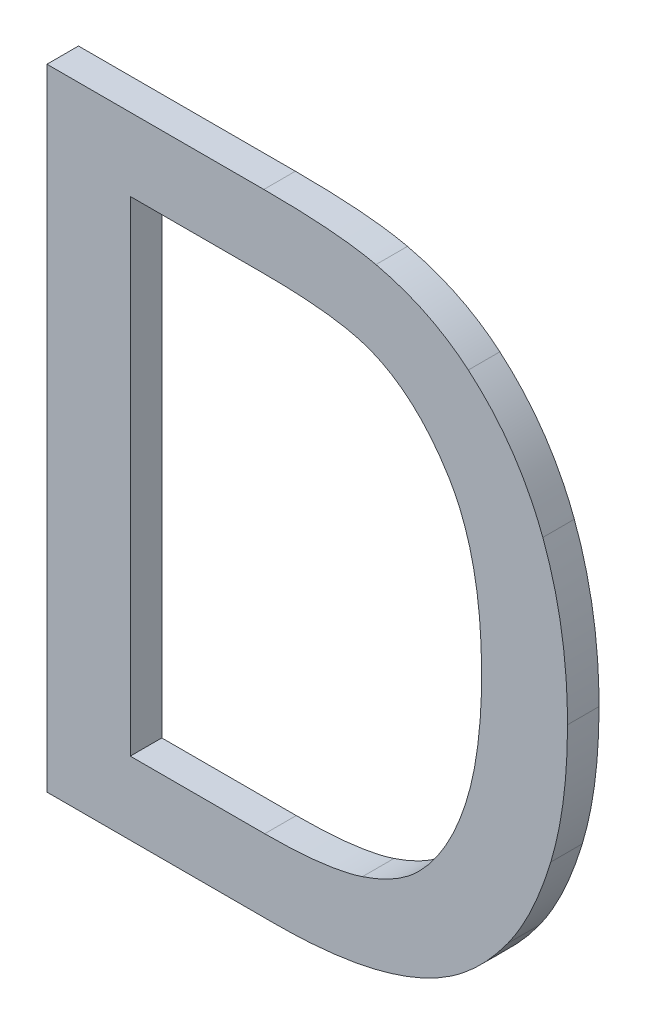
ISO-10303-21;
HEADER;
FILE_DESCRIPTION(('STEP AP214'),'2;1');
FILE_NAME('part.step','',(''),(''),'','','');
FILE_SCHEMA(('AUTOMOTIVE_DESIGN { 1 0 10303 214 1 1 1 1 }'));
ENDSEC;
DATA;
#1=APPLICATION_CONTEXT('core data for automotive mechanical design processes');
#2=APPLICATION_PROTOCOL_DEFINITION('international standard','automotive_design',2000,#1);
#3=PRODUCT_CONTEXT('',#1,'mechanical');
#4=PRODUCT('Part','Part','',(#3));
#5=PRODUCT_RELATED_PRODUCT_CATEGORY('part','',(#4));
#6=PRODUCT_DEFINITION_FORMATION('','',#4);
#7=PRODUCT_DEFINITION_CONTEXT('part definition',#1,'design');
#8=PRODUCT_DEFINITION('design','',#6,#7);
#9=PRODUCT_DEFINITION_SHAPE('','',#8);
#10=(LENGTH_UNIT() NAMED_UNIT(*) SI_UNIT(.MILLI.,.METRE.));
#11=(NAMED_UNIT(*) PLANE_ANGLE_UNIT() SI_UNIT($,.RADIAN.));
#12=(NAMED_UNIT(*) SI_UNIT($,.STERADIAN.) SOLID_ANGLE_UNIT());
#13=UNCERTAINTY_MEASURE_WITH_UNIT(LENGTH_MEASURE(1.E-05),#10,'distance_accuracy_value','');
#14=(GEOMETRIC_REPRESENTATION_CONTEXT(3) GLOBAL_UNCERTAINTY_ASSIGNED_CONTEXT((#13)) GLOBAL_UNIT_ASSIGNED_CONTEXT((#10,
#11,#12)) REPRESENTATION_CONTEXT('',''));
#15=CARTESIAN_POINT('',(0.,0.,0.));
#16=DIRECTION('',(0.,0.,1.));
#17=DIRECTION('',(1.,0.,0.));
#18=AXIS2_PLACEMENT_3D('',#15,#16,#17);
#19=CARTESIAN_POINT('',(11.292084779264,0.500354481602,0.05));
#20=DIRECTION('',(0.,0.,1.));
#21=DIRECTION('',(1.,0.,0.));
#22=AXIS2_PLACEMENT_3D('',#19,#20,#21);
#23=PLANE('',#22);
#24=DIRECTION('',(1.,0.,0.));
#25=VECTOR('',#24,1.);
#26=CARTESIAN_POINT('',(11.059683866279,0.115552325581,0.05));
#27=LINE('',#26,#25);
#28=CARTESIAN_POINT('',(11.059683866279,0.115552325581,0.05));
#29=VERTEX_POINT('',#28);
#30=CARTESIAN_POINT('',(11.272937863372,0.115552325581,0.05));
#31=VERTEX_POINT('',#30);
#32=EDGE_CURVE('E249',#29,#31,#27,.T.);
#33=ORIENTED_EDGE('',*,*,#32,.F.);
#34=DIRECTION('',(0.,-1.,0.));
#35=VECTOR('',#34,1.);
#36=CARTESIAN_POINT('',(11.059683866279,0.884447674419,0.05));
#37=LINE('',#36,#35);
#38=CARTESIAN_POINT('',(11.059683866279,0.884447674419,0.05));
#39=VERTEX_POINT('',#38);
#40=EDGE_CURVE('E91',#39,#29,#37,.T.);
#41=ORIENTED_EDGE('',*,*,#40,.F.);
#42=DIRECTION('',(-1.,0.,0.));
#43=VECTOR('',#42,1.);
#44=CARTESIAN_POINT('',(11.26953125,0.884447674419,0.05));
#45=LINE('',#44,#43);
#46=CARTESIAN_POINT('',(11.26953125,0.884447674419,0.05));
#47=VERTEX_POINT('',#46);
#48=EDGE_CURVE('E238',#47,#39,#45,.T.);
#49=ORIENTED_EDGE('',*,*,#48,.F.);
#50=CARTESIAN_POINT('',(11.440543241279,0.863871729651,0.05));
#51=CARTESIAN_POINT('',(11.387400072674,0.884447674419,0.05));
#52=CARTESIAN_POINT('',(11.26953125,0.884447674419,0.05));
#53=(BOUNDED_CURVE() B_SPLINE_CURVE(2,(#50,#51,#52),.UNSPECIFIED.,.F.,
.F.) B_SPLINE_CURVE_WITH_KNOTS((3,3),(0.,1.),
.UNSPECIFIED.) CURVE() GEOMETRIC_REPRESENTATION_ITEM() RATIONAL_B_SPLINE_CURVE((1.,1.,1.)) REPRESENTATION_ITEM(''));
#54=CARTESIAN_POINT('',(11.440543241279,0.863871729651,0.05));
#55=VERTEX_POINT('',#54);
#56=EDGE_CURVE('E248',#55,#47,#53,.T.);
#57=ORIENTED_EDGE('',*,*,#56,.F.);
#58=CARTESIAN_POINT('',(11.565543241279,0.750227107558,0.05));
#59=CARTESIAN_POINT('',(11.514126090116,0.835029069767,0.05));
#60=CARTESIAN_POINT('',(11.440543241279,0.863871729651,0.05));
#61=(BOUNDED_CURVE() B_SPLINE_CURVE(2,(#58,#59,#60),.UNSPECIFIED.,.F.,
.F.) B_SPLINE_CURVE_WITH_KNOTS((3,3),(0.,1.),
.UNSPECIFIED.) CURVE() GEOMETRIC_REPRESENTATION_ITEM() RATIONAL_B_SPLINE_CURVE((1.,1.,1.)) REPRESENTATION_ITEM(''));
#62=CARTESIAN_POINT('',(11.565543241279,0.750227107558,0.05));
#63=VERTEX_POINT('',#62);
#64=EDGE_CURVE('E373',#63,#55,#61,.T.);
#65=ORIENTED_EDGE('',*,*,#64,.F.);
#66=CARTESIAN_POINT('',(11.617005813953,0.50753997093,0.05));
#67=CARTESIAN_POINT('',(11.617005813953,0.66547056686,0.05));
#68=CARTESIAN_POINT('',(11.565543241279,0.750227107558,0.05));
#69=(BOUNDED_CURVE() B_SPLINE_CURVE(2,(#66,#67,#68),.UNSPECIFIED.,.F.,
.F.) B_SPLINE_CURVE_WITH_KNOTS((3,3),(0.,1.),
.UNSPECIFIED.) CURVE() GEOMETRIC_REPRESENTATION_ITEM() RATIONAL_B_SPLINE_CURVE((1.,1.,1.)) REPRESENTATION_ITEM(''));
#70=CARTESIAN_POINT('',(11.617005813953,0.50753997093,0.05));
#71=VERTEX_POINT('',#70);
#72=EDGE_CURVE('E322',#71,#63,#69,.T.);
#73=ORIENTED_EDGE('',*,*,#72,.F.);
#74=CARTESIAN_POINT('',(11.590752180233,0.313590116279,0.05));
#75=CARTESIAN_POINT('',(11.617005813953,0.393577398256,0.05));
#76=CARTESIAN_POINT('',(11.617005813953,0.50753997093,0.05));
#77=(BOUNDED_CURVE() B_SPLINE_CURVE(2,(#74,#75,#76),.UNSPECIFIED.,.F.,
.F.) B_SPLINE_CURVE_WITH_KNOTS((3,3),(0.,1.),
.UNSPECIFIED.) CURVE() GEOMETRIC_REPRESENTATION_ITEM() RATIONAL_B_SPLINE_CURVE((1.,1.,1.)) REPRESENTATION_ITEM(''));
#78=CARTESIAN_POINT('',(11.590752180233,0.313590116279,0.05));
#79=VERTEX_POINT('',#78);
#80=EDGE_CURVE('E580',#79,#71,#77,.T.);
#81=ORIENTED_EDGE('',*,*,#80,.F.);
#82=CARTESIAN_POINT('',(11.517532703488,0.186273619186,0.05));
#83=CARTESIAN_POINT('',(11.564543968023,0.233648255814,0.05));
#84=CARTESIAN_POINT('',(11.590752180233,0.313590116279,0.05));
#85=(BOUNDED_CURVE() B_SPLINE_CURVE(2,(#82,#83,#84),.UNSPECIFIED.,.F.,
.F.) B_SPLINE_CURVE_WITH_KNOTS((3,3),(0.,1.),
.UNSPECIFIED.) CURVE() GEOMETRIC_REPRESENTATION_ITEM() RATIONAL_B_SPLINE_CURVE((1.,1.,1.)) REPRESENTATION_ITEM(''));
#86=CARTESIAN_POINT('',(11.517532703488,0.186273619186,0.05));
#87=VERTEX_POINT('',#86);
#88=EDGE_CURVE('E332',#87,#79,#85,.T.);
#89=ORIENTED_EDGE('',*,*,#88,.F.);
#90=CARTESIAN_POINT('',(11.427916061047,0.134084302326,0.05));
#91=CARTESIAN_POINT('',(11.484147892442,0.15261627907,0.05));
#92=CARTESIAN_POINT('',(11.517532703488,0.186273619186,0.05));
#93=(BOUNDED_CURVE() B_SPLINE_CURVE(2,(#90,#91,#92),.UNSPECIFIED.,.F.,
.F.) B_SPLINE_CURVE_WITH_KNOTS((3,3),(0.,1.),
.UNSPECIFIED.) CURVE() GEOMETRIC_REPRESENTATION_ITEM() RATIONAL_B_SPLINE_CURVE((1.,1.,1.)) REPRESENTATION_ITEM(''));
#94=CARTESIAN_POINT('',(11.427916061047,0.134084302326,0.05));
#95=VERTEX_POINT('',#94);
#96=EDGE_CURVE('E303',#95,#87,#93,.T.);
#97=ORIENTED_EDGE('',*,*,#96,.F.);
#98=CARTESIAN_POINT('',(11.272937863372,0.115552325581,0.05));
#99=CARTESIAN_POINT('',(11.371729651163,0.115552325581,0.05));
#100=CARTESIAN_POINT('',(11.427916061047,0.134084302326,0.05));
#101=(BOUNDED_CURVE() B_SPLINE_CURVE(2,(#98,#99,#100),.UNSPECIFIED.,.F.,
.F.) B_SPLINE_CURVE_WITH_KNOTS((3,3),(0.,1.),
.UNSPECIFIED.) CURVE() GEOMETRIC_REPRESENTATION_ITEM() RATIONAL_B_SPLINE_CURVE((1.,1.,1.)) REPRESENTATION_ITEM(''));
#102=EDGE_CURVE('E29',#31,#95,#101,.T.);
#103=ORIENTED_EDGE('',*,*,#102,.F.);
#104=EDGE_LOOP('',(#33,#41,#49,#57,#65,#73,#81,#89,#97,#103));
#105=FACE_BOUND('',#104,.T.);
#106=DIRECTION('',(0.,1.,0.));
#107=VECTOR('',#106,1.);
#108=CARTESIAN_POINT('',(10.927507267442,0.,0.05));
#109=LINE('',#108,#107);
#110=CARTESIAN_POINT('',(10.927507267442,0.,0.05));
#111=VERTEX_POINT('',#110);
#112=CARTESIAN_POINT('',(10.927507267442,1.,0.05));
#113=VERTEX_POINT('',#112);
#114=EDGE_CURVE('E239',#111,#113,#109,.T.);
#115=ORIENTED_EDGE('',*,*,#114,.F.);
#116=DIRECTION('',(-1.,0.,0.));
#117=VECTOR('',#116,1.);
#118=CARTESIAN_POINT('',(11.287926962209,0.,0.05));
#119=LINE('',#118,#117);
#120=CARTESIAN_POINT('',(11.287926962209,0.,0.05));
#121=VERTEX_POINT('',#120);
#122=EDGE_CURVE('E268',#121,#111,#119,.T.);
#123=ORIENTED_EDGE('',*,*,#122,.F.);
#124=CARTESIAN_POINT('',(11.448355741279,0.01703306686047,0.05));
#125=CARTESIAN_POINT('',(11.378542877907,0.,0.05));
#126=CARTESIAN_POINT('',(11.287926962209,0.,0.05));
#127=(BOUNDED_CURVE() B_SPLINE_CURVE(2,(#124,#125,#126),.UNSPECIFIED.,.F.,
.F.) B_SPLINE_CURVE_WITH_KNOTS((3,3),(0.,1.),
.UNSPECIFIED.) CURVE() GEOMETRIC_REPRESENTATION_ITEM() RATIONAL_B_SPLINE_CURVE((1.,1.,1.)) REPRESENTATION_ITEM(''));
#128=CARTESIAN_POINT('',(11.448355741279,0.01703306686047,0.05));
#129=VERTEX_POINT('',#128);
#130=EDGE_CURVE('E396',#129,#121,#127,.T.);
#131=ORIENTED_EDGE('',*,*,#130,.F.);
#132=CARTESIAN_POINT('',(11.567587209302,0.06717841569767,0.05));
#133=CARTESIAN_POINT('',(11.518214026163,0.03411155523256,0.05));
#134=CARTESIAN_POINT('',(11.448355741279,0.01703306686047,0.05));
#135=(BOUNDED_CURVE() B_SPLINE_CURVE(2,(#132,#133,#134),.UNSPECIFIED.,.F.,
.F.) B_SPLINE_CURVE_WITH_KNOTS((3,3),(0.,1.),
.UNSPECIFIED.) CURVE() GEOMETRIC_REPRESENTATION_ITEM() RATIONAL_B_SPLINE_CURVE((1.,1.,1.)) REPRESENTATION_ITEM(''));
#136=CARTESIAN_POINT('',(11.567587209302,0.06717841569767,0.05));
#137=VERTEX_POINT('',#136);
#138=EDGE_CURVE('E281',#137,#129,#135,.T.);
#139=ORIENTED_EDGE('',*,*,#138,.F.);
#140=CARTESIAN_POINT('',(11.658566497093,0.15793059593,0.05));
#141=CARTESIAN_POINT('',(11.617005813953,0.100290697674,0.05));
#142=CARTESIAN_POINT('',(11.567587209302,0.06717841569767,0.05));
#143=(BOUNDED_CURVE() B_SPLINE_CURVE(2,(#140,#141,#142),.UNSPECIFIED.,.F.,
.F.) B_SPLINE_CURVE_WITH_KNOTS((3,3),(0.,1.),
.UNSPECIFIED.) CURVE() GEOMETRIC_REPRESENTATION_ITEM() RATIONAL_B_SPLINE_CURVE((1.,1.,1.)) REPRESENTATION_ITEM(''));
#144=CARTESIAN_POINT('',(11.658566497093,0.15793059593,0.05));
#145=VERTEX_POINT('',#144);
#146=EDGE_CURVE('E155',#145,#137,#143,.T.);
#147=ORIENTED_EDGE('',*,*,#146,.F.);
#148=CARTESIAN_POINT('',(11.726698764535,0.303551962209,0.05));
#149=CARTESIAN_POINT('',(11.700127180233,0.215570494186,0.05));
#150=CARTESIAN_POINT('',(11.658566497093,0.15793059593,0.05));
#151=(BOUNDED_CURVE() B_SPLINE_CURVE(2,(#148,#149,#150),.UNSPECIFIED.,.F.,
.F.) B_SPLINE_CURVE_WITH_KNOTS((3,3),(0.,1.),
.UNSPECIFIED.) CURVE() GEOMETRIC_REPRESENTATION_ITEM() RATIONAL_B_SPLINE_CURVE((1.,1.,1.)) REPRESENTATION_ITEM(''));
#152=CARTESIAN_POINT('',(11.726698764535,0.303551962209,0.05));
#153=VERTEX_POINT('',#152);
#154=EDGE_CURVE('E214',#153,#145,#151,.T.);
#155=ORIENTED_EDGE('',*,*,#154,.F.);
#156=CARTESIAN_POINT('',(11.753270348837,0.505450581395,0.05));
#157=CARTESIAN_POINT('',(11.753270348837,0.391533430233,0.05));
#158=CARTESIAN_POINT('',(11.726698764535,0.303551962209,0.05));
#159=(BOUNDED_CURVE() B_SPLINE_CURVE(2,(#156,#157,#158),.UNSPECIFIED.,.F.,
.F.) B_SPLINE_CURVE_WITH_KNOTS((3,3),(0.,1.),
.UNSPECIFIED.) CURVE() GEOMETRIC_REPRESENTATION_ITEM() RATIONAL_B_SPLINE_CURVE((1.,1.,1.)) REPRESENTATION_ITEM(''));
#160=CARTESIAN_POINT('',(11.753270348837,0.505450581395,0.05));
#161=VERTEX_POINT('',#160);
#162=EDGE_CURVE('E20',#161,#153,#159,.T.);
#163=ORIENTED_EDGE('',*,*,#162,.F.);
#164=CARTESIAN_POINT('',(11.714071584302,0.743186773256,0.05));
#165=CARTESIAN_POINT('',(11.753270348837,0.639171511628,0.05));
#166=CARTESIAN_POINT('',(11.753270348837,0.505450581395,0.05));
#167=(BOUNDED_CURVE() B_SPLINE_CURVE(2,(#164,#165,#166),.UNSPECIFIED.,.F.,
.F.) B_SPLINE_CURVE_WITH_KNOTS((3,3),(0.,1.),
.UNSPECIFIED.) CURVE() GEOMETRIC_REPRESENTATION_ITEM() RATIONAL_B_SPLINE_CURVE((1.,1.,1.)) REPRESENTATION_ITEM(''));
#168=CARTESIAN_POINT('',(11.714071584302,0.743186773256,0.05));
#169=VERTEX_POINT('',#168);
#170=EDGE_CURVE('E199',#169,#161,#167,.T.);
#171=ORIENTED_EDGE('',*,*,#170,.F.);
#172=CARTESIAN_POINT('',(11.595884811047,0.9140625,0.05));
#173=CARTESIAN_POINT('',(11.674918241279,0.847202034884,0.05));
#174=CARTESIAN_POINT('',(11.714071584302,0.743186773256,0.05));
#175=(BOUNDED_CURVE() B_SPLINE_CURVE(2,(#172,#173,#174),.UNSPECIFIED.,.F.,
.F.) B_SPLINE_CURVE_WITH_KNOTS((3,3),(0.,1.),
.UNSPECIFIED.) CURVE() GEOMETRIC_REPRESENTATION_ITEM() RATIONAL_B_SPLINE_CURVE((1.,1.,1.)) REPRESENTATION_ITEM(''));
#176=CARTESIAN_POINT('',(11.595884811047,0.9140625,0.05));
#177=VERTEX_POINT('',#176);
#178=EDGE_CURVE('E380',#177,#169,#175,.T.);
#179=ORIENTED_EDGE('',*,*,#178,.F.);
#180=CARTESIAN_POINT('',(11.449400436047,0.985692223837,0.05));
#181=CARTESIAN_POINT('',(11.535247093023,0.965888444767,0.05));
#182=CARTESIAN_POINT('',(11.595884811047,0.9140625,0.05));
#183=(BOUNDED_CURVE() B_SPLINE_CURVE(2,(#180,#181,#182),.UNSPECIFIED.,.F.,
.F.) B_SPLINE_CURVE_WITH_KNOTS((3,3),(0.,1.),
.UNSPECIFIED.) CURVE() GEOMETRIC_REPRESENTATION_ITEM() RATIONAL_B_SPLINE_CURVE((1.,1.,1.)) REPRESENTATION_ITEM(''));
#184=CARTESIAN_POINT('',(11.449400436047,0.985692223837,0.05));
#185=VERTEX_POINT('',#184);
#186=EDGE_CURVE('E426',#185,#177,#183,.T.);
#187=ORIENTED_EDGE('',*,*,#186,.F.);
#188=CARTESIAN_POINT('',(11.271575218023,1.,0.05));
#189=CARTESIAN_POINT('',(11.388081395349,1.,0.05));
#190=CARTESIAN_POINT('',(11.449400436047,0.985692223837,0.05));
#191=(BOUNDED_CURVE() B_SPLINE_CURVE(2,(#188,#189,#190),.UNSPECIFIED.,.F.,
.F.) B_SPLINE_CURVE_WITH_KNOTS((3,3),(0.,1.),
.UNSPECIFIED.) CURVE() GEOMETRIC_REPRESENTATION_ITEM() RATIONAL_B_SPLINE_CURVE((1.,1.,1.)) REPRESENTATION_ITEM(''));
#192=CARTESIAN_POINT('',(11.271575218023,1.,0.05));
#193=VERTEX_POINT('',#192);
#194=EDGE_CURVE('E231',#193,#185,#191,.T.);
#195=ORIENTED_EDGE('',*,*,#194,.F.);
#196=DIRECTION('',(1.,0.,0.));
#197=VECTOR('',#196,1.);
#198=CARTESIAN_POINT('',(10.927507267442,1.,0.05));
#199=LINE('',#198,#197);
#200=EDGE_CURVE('E260',#113,#193,#199,.T.);
#201=ORIENTED_EDGE('',*,*,#200,.F.);
#202=EDGE_LOOP('',(#115,#123,#131,#139,#147,#155,#163,#171,#179,#187,#195,#201));
#203=FACE_BOUND('',#202,.T.);
#204=ADVANCED_FACE('F17',(#105,#203),#23,.T.);
#205=CARTESIAN_POINT('',(11.292084779264,0.500354481602,0.));
#206=DIRECTION('',(0.,0.,1.));
#207=DIRECTION('',(1.,0.,0.));
#208=AXIS2_PLACEMENT_3D('',#205,#206,#207);
#209=PLANE('',#208);
#210=CARTESIAN_POINT('',(11.272937863372,0.115552325581,0.));
#211=CARTESIAN_POINT('',(11.371729651163,0.115552325581,0.));
#212=CARTESIAN_POINT('',(11.427916061047,0.134084302326,0.));
#213=(BOUNDED_CURVE() B_SPLINE_CURVE(2,(#210,#211,#212),.UNSPECIFIED.,.F.,
.F.) B_SPLINE_CURVE_WITH_KNOTS((3,3),(0.,1.),
.UNSPECIFIED.) CURVE() GEOMETRIC_REPRESENTATION_ITEM() RATIONAL_B_SPLINE_CURVE((1.,1.,1.)) REPRESENTATION_ITEM(''));
#214=CARTESIAN_POINT('',(11.272937863372,0.115552325581,0.));
#215=VERTEX_POINT('',#214);
#216=CARTESIAN_POINT('',(11.427916061047,0.134084302326,0.));
#217=VERTEX_POINT('',#216);
#218=EDGE_CURVE('E11',#215,#217,#213,.T.);
#219=ORIENTED_EDGE('',*,*,#218,.T.);
#220=CARTESIAN_POINT('',(11.427916061047,0.134084302326,0.));
#221=CARTESIAN_POINT('',(11.484147892442,0.15261627907,0.));
#222=CARTESIAN_POINT('',(11.517532703488,0.186273619186,0.));
#223=(BOUNDED_CURVE() B_SPLINE_CURVE(2,(#220,#221,#222),.UNSPECIFIED.,.F.,
.F.) B_SPLINE_CURVE_WITH_KNOTS((3,3),(0.,1.),
.UNSPECIFIED.) CURVE() GEOMETRIC_REPRESENTATION_ITEM() RATIONAL_B_SPLINE_CURVE((1.,1.,1.)) REPRESENTATION_ITEM(''));
#224=CARTESIAN_POINT('',(11.517532703488,0.186273619186,0.));
#225=VERTEX_POINT('',#224);
#226=EDGE_CURVE('E302',#217,#225,#223,.T.);
#227=ORIENTED_EDGE('',*,*,#226,.T.);
#228=CARTESIAN_POINT('',(11.517532703488,0.186273619186,0.));
#229=CARTESIAN_POINT('',(11.564543968023,0.233648255814,0.));
#230=CARTESIAN_POINT('',(11.590752180233,0.313590116279,0.));
#231=(BOUNDED_CURVE() B_SPLINE_CURVE(2,(#228,#229,#230),.UNSPECIFIED.,.F.,
.F.) B_SPLINE_CURVE_WITH_KNOTS((3,3),(0.,1.),
.UNSPECIFIED.) CURVE() GEOMETRIC_REPRESENTATION_ITEM() RATIONAL_B_SPLINE_CURVE((1.,1.,1.)) REPRESENTATION_ITEM(''));
#232=CARTESIAN_POINT('',(11.590752180233,0.313590116279,0.));
#233=VERTEX_POINT('',#232);
#234=EDGE_CURVE('E323',#225,#233,#231,.T.);
#235=ORIENTED_EDGE('',*,*,#234,.T.);
#236=CARTESIAN_POINT('',(11.590752180233,0.313590116279,0.));
#237=CARTESIAN_POINT('',(11.617005813953,0.393577398256,0.));
#238=CARTESIAN_POINT('',(11.617005813953,0.50753997093,0.));
#239=(BOUNDED_CURVE() B_SPLINE_CURVE(2,(#236,#237,#238),.UNSPECIFIED.,.F.,
.F.) B_SPLINE_CURVE_WITH_KNOTS((3,3),(0.,1.),
.UNSPECIFIED.) CURVE() GEOMETRIC_REPRESENTATION_ITEM() RATIONAL_B_SPLINE_CURVE((1.,1.,1.)) REPRESENTATION_ITEM(''));
#240=CARTESIAN_POINT('',(11.617005813953,0.50753997093,0.));
#241=VERTEX_POINT('',#240);
#242=EDGE_CURVE('E506',#233,#241,#239,.T.);
#243=ORIENTED_EDGE('',*,*,#242,.T.);
#244=CARTESIAN_POINT('',(11.617005813953,0.50753997093,0.));
#245=CARTESIAN_POINT('',(11.617005813953,0.66547056686,0.));
#246=CARTESIAN_POINT('',(11.565543241279,0.750227107558,0.));
#247=(BOUNDED_CURVE() B_SPLINE_CURVE(2,(#244,#245,#246),.UNSPECIFIED.,.F.,
.F.) B_SPLINE_CURVE_WITH_KNOTS((3,3),(0.,1.),
.UNSPECIFIED.) CURVE() GEOMETRIC_REPRESENTATION_ITEM() RATIONAL_B_SPLINE_CURVE((1.,1.,1.)) REPRESENTATION_ITEM(''));
#248=CARTESIAN_POINT('',(11.565543241279,0.750227107558,0.));
#249=VERTEX_POINT('',#248);
#250=EDGE_CURVE('E313',#241,#249,#247,.T.);
#251=ORIENTED_EDGE('',*,*,#250,.T.);
#252=CARTESIAN_POINT('',(11.565543241279,0.750227107558,0.));
#253=CARTESIAN_POINT('',(11.514126090116,0.835029069767,0.));
#254=CARTESIAN_POINT('',(11.440543241279,0.863871729651,0.));
#255=(BOUNDED_CURVE() B_SPLINE_CURVE(2,(#252,#253,#254),.UNSPECIFIED.,.F.,
.F.) B_SPLINE_CURVE_WITH_KNOTS((3,3),(0.,1.),
.UNSPECIFIED.) CURVE() GEOMETRIC_REPRESENTATION_ITEM() RATIONAL_B_SPLINE_CURVE((1.,1.,1.)) REPRESENTATION_ITEM(''));
#256=CARTESIAN_POINT('',(11.440543241279,0.863871729651,0.));
#257=VERTEX_POINT('',#256);
#258=EDGE_CURVE('E430',#249,#257,#255,.T.);
#259=ORIENTED_EDGE('',*,*,#258,.T.);
#260=CARTESIAN_POINT('',(11.440543241279,0.863871729651,0.));
#261=CARTESIAN_POINT('',(11.387400072674,0.884447674419,0.));
#262=CARTESIAN_POINT('',(11.26953125,0.884447674419,0.));
#263=(BOUNDED_CURVE() B_SPLINE_CURVE(2,(#260,#261,#262),.UNSPECIFIED.,.F.,
.F.) B_SPLINE_CURVE_WITH_KNOTS((3,3),(0.,1.),
.UNSPECIFIED.) CURVE() GEOMETRIC_REPRESENTATION_ITEM() RATIONAL_B_SPLINE_CURVE((1.,1.,1.)) REPRESENTATION_ITEM(''));
#264=CARTESIAN_POINT('',(11.26953125,0.884447674419,0.));
#265=VERTEX_POINT('',#264);
#266=EDGE_CURVE('E374',#257,#265,#263,.T.);
#267=ORIENTED_EDGE('',*,*,#266,.T.);
#268=DIRECTION('',(-1.,0.,0.));
#269=VECTOR('',#268,1.);
#270=CARTESIAN_POINT('',(11.26953125,0.884447674419,0.));
#271=LINE('',#270,#269);
#272=CARTESIAN_POINT('',(11.059683866279,0.884447674419,0.));
#273=VERTEX_POINT('',#272);
#274=EDGE_CURVE('E235',#265,#273,#271,.T.);
#275=ORIENTED_EDGE('',*,*,#274,.T.);
#276=DIRECTION('',(0.,-1.,0.));
#277=VECTOR('',#276,1.);
#278=CARTESIAN_POINT('',(11.059683866279,0.884447674419,0.));
#279=LINE('',#278,#277);
#280=CARTESIAN_POINT('',(11.059683866279,0.115552325581,0.));
#281=VERTEX_POINT('',#280);
#282=EDGE_CURVE('E104',#273,#281,#279,.T.);
#283=ORIENTED_EDGE('',*,*,#282,.T.);
#284=DIRECTION('',(1.,0.,0.));
#285=VECTOR('',#284,1.);
#286=CARTESIAN_POINT('',(11.059683866279,0.115552325581,0.));
#287=LINE('',#286,#285);
#288=EDGE_CURVE('E436',#281,#215,#287,.T.);
#289=ORIENTED_EDGE('',*,*,#288,.T.);
#290=EDGE_LOOP('',(#219,#227,#235,#243,#251,#259,#267,#275,#283,#289));
#291=FACE_BOUND('',#290,.T.);
#292=DIRECTION('',(1.,0.,0.));
#293=VECTOR('',#292,1.);
#294=CARTESIAN_POINT('',(10.927507267442,1.,0.));
#295=LINE('',#294,#293);
#296=CARTESIAN_POINT('',(10.927507267442,1.,0.));
#297=VERTEX_POINT('',#296);
#298=CARTESIAN_POINT('',(11.271575218023,1.,0.));
#299=VERTEX_POINT('',#298);
#300=EDGE_CURVE('E280',#297,#299,#295,.T.);
#301=ORIENTED_EDGE('',*,*,#300,.T.);
#302=CARTESIAN_POINT('',(11.271575218023,1.,0.));
#303=CARTESIAN_POINT('',(11.388081395349,1.,0.));
#304=CARTESIAN_POINT('',(11.449400436047,0.985692223837,0.));
#305=(BOUNDED_CURVE() B_SPLINE_CURVE(2,(#302,#303,#304),.UNSPECIFIED.,.F.,
.F.) B_SPLINE_CURVE_WITH_KNOTS((3,3),(0.,1.),
.UNSPECIFIED.) CURVE() GEOMETRIC_REPRESENTATION_ITEM() RATIONAL_B_SPLINE_CURVE((1.,1.,1.)) REPRESENTATION_ITEM(''));
#306=CARTESIAN_POINT('',(11.449400436047,0.985692223837,0.));
#307=VERTEX_POINT('',#306);
#308=EDGE_CURVE('E255',#299,#307,#305,.T.);
#309=ORIENTED_EDGE('',*,*,#308,.T.);
#310=CARTESIAN_POINT('',(11.449400436047,0.985692223837,0.));
#311=CARTESIAN_POINT('',(11.535247093023,0.965888444767,0.));
#312=CARTESIAN_POINT('',(11.595884811047,0.9140625,0.));
#313=(BOUNDED_CURVE() B_SPLINE_CURVE(2,(#310,#311,#312),.UNSPECIFIED.,.F.,
.F.) B_SPLINE_CURVE_WITH_KNOTS((3,3),(0.,1.),
.UNSPECIFIED.) CURVE() GEOMETRIC_REPRESENTATION_ITEM() RATIONAL_B_SPLINE_CURVE((1.,1.,1.)) REPRESENTATION_ITEM(''));
#314=CARTESIAN_POINT('',(11.595884811047,0.9140625,0.));
#315=VERTEX_POINT('',#314);
#316=EDGE_CURVE('E495',#307,#315,#313,.T.);
#317=ORIENTED_EDGE('',*,*,#316,.T.);
#318=CARTESIAN_POINT('',(11.595884811047,0.9140625,0.));
#319=CARTESIAN_POINT('',(11.674918241279,0.847202034884,0.));
#320=CARTESIAN_POINT('',(11.714071584302,0.743186773256,0.));
#321=(BOUNDED_CURVE() B_SPLINE_CURVE(2,(#318,#319,#320),.UNSPECIFIED.,.F.,
.F.) B_SPLINE_CURVE_WITH_KNOTS((3,3),(0.,1.),
.UNSPECIFIED.) CURVE() GEOMETRIC_REPRESENTATION_ITEM() RATIONAL_B_SPLINE_CURVE((1.,1.,1.)) REPRESENTATION_ITEM(''));
#322=CARTESIAN_POINT('',(11.714071584302,0.743186773256,0.));
#323=VERTEX_POINT('',#322);
#324=EDGE_CURVE('E190',#315,#323,#321,.T.);
#325=ORIENTED_EDGE('',*,*,#324,.T.);
#326=CARTESIAN_POINT('',(11.714071584302,0.743186773256,0.));
#327=CARTESIAN_POINT('',(11.753270348837,0.639171511628,0.));
#328=CARTESIAN_POINT('',(11.753270348837,0.505450581395,0.));
#329=(BOUNDED_CURVE() B_SPLINE_CURVE(2,(#326,#327,#328),.UNSPECIFIED.,.F.,
.F.) B_SPLINE_CURVE_WITH_KNOTS((3,3),(0.,1.),
.UNSPECIFIED.) CURVE() GEOMETRIC_REPRESENTATION_ITEM() RATIONAL_B_SPLINE_CURVE((1.,1.,1.)) REPRESENTATION_ITEM(''));
#330=CARTESIAN_POINT('',(11.753270348837,0.505450581395,0.));
#331=VERTEX_POINT('',#330);
#332=EDGE_CURVE('E209',#323,#331,#329,.T.);
#333=ORIENTED_EDGE('',*,*,#332,.T.);
#334=CARTESIAN_POINT('',(11.753270348837,0.505450581395,0.));
#335=CARTESIAN_POINT('',(11.753270348837,0.391533430233,0.));
#336=CARTESIAN_POINT('',(11.726698764535,0.303551962209,0.));
#337=(BOUNDED_CURVE() B_SPLINE_CURVE(2,(#334,#335,#336),.UNSPECIFIED.,.F.,
.F.) B_SPLINE_CURVE_WITH_KNOTS((3,3),(0.,1.),
.UNSPECIFIED.) CURVE() GEOMETRIC_REPRESENTATION_ITEM() RATIONAL_B_SPLINE_CURVE((1.,1.,1.)) REPRESENTATION_ITEM(''));
#338=CARTESIAN_POINT('',(11.726698764535,0.303551962209,0.));
#339=VERTEX_POINT('',#338);
#340=EDGE_CURVE('E219',#331,#339,#337,.T.);
#341=ORIENTED_EDGE('',*,*,#340,.T.);
#342=CARTESIAN_POINT('',(11.726698764535,0.303551962209,0.));
#343=CARTESIAN_POINT('',(11.700127180233,0.215570494186,0.));
#344=CARTESIAN_POINT('',(11.658566497093,0.15793059593,0.));
#345=(BOUNDED_CURVE() B_SPLINE_CURVE(2,(#342,#343,#344),.UNSPECIFIED.,.F.,
.F.) B_SPLINE_CURVE_WITH_KNOTS((3,3),(0.,1.),
.UNSPECIFIED.) CURVE() GEOMETRIC_REPRESENTATION_ITEM() RATIONAL_B_SPLINE_CURVE((1.,1.,1.)) REPRESENTATION_ITEM(''));
#346=CARTESIAN_POINT('',(11.658566497093,0.15793059593,0.));
#347=VERTEX_POINT('',#346);
#348=EDGE_CURVE('E139',#339,#347,#345,.T.);
#349=ORIENTED_EDGE('',*,*,#348,.T.);
#350=CARTESIAN_POINT('',(11.658566497093,0.15793059593,0.));
#351=CARTESIAN_POINT('',(11.617005813953,0.100290697674,0.));
#352=CARTESIAN_POINT('',(11.567587209302,0.06717841569767,0.));
#353=(BOUNDED_CURVE() B_SPLINE_CURVE(2,(#350,#351,#352),.UNSPECIFIED.,.F.,
.F.) B_SPLINE_CURVE_WITH_KNOTS((3,3),(0.,1.),
.UNSPECIFIED.) CURVE() GEOMETRIC_REPRESENTATION_ITEM() RATIONAL_B_SPLINE_CURVE((1.,1.,1.)) REPRESENTATION_ITEM(''));
#354=CARTESIAN_POINT('',(11.567587209302,0.06717841569767,0.));
#355=VERTEX_POINT('',#354);
#356=EDGE_CURVE('E379',#347,#355,#353,.T.);
#357=ORIENTED_EDGE('',*,*,#356,.T.);
#358=CARTESIAN_POINT('',(11.567587209302,0.06717841569767,0.));
#359=CARTESIAN_POINT('',(11.518214026163,0.03411155523256,0.));
#360=CARTESIAN_POINT('',(11.448355741279,0.01703306686047,0.));
#361=(BOUNDED_CURVE() B_SPLINE_CURVE(2,(#358,#359,#360),.UNSPECIFIED.,.F.,
.F.) B_SPLINE_CURVE_WITH_KNOTS((3,3),(0.,1.),
.UNSPECIFIED.) CURVE() GEOMETRIC_REPRESENTATION_ITEM() RATIONAL_B_SPLINE_CURVE((1.,1.,1.)) REPRESENTATION_ITEM(''));
#362=CARTESIAN_POINT('',(11.448355741279,0.01703306686047,0.));
#363=VERTEX_POINT('',#362);
#364=EDGE_CURVE('E285',#355,#363,#361,.T.);
#365=ORIENTED_EDGE('',*,*,#364,.T.);
#366=CARTESIAN_POINT('',(11.448355741279,0.01703306686047,0.));
#367=CARTESIAN_POINT('',(11.378542877907,0.,0.));
#368=CARTESIAN_POINT('',(11.287926962209,0.,0.));
#369=(BOUNDED_CURVE() B_SPLINE_CURVE(2,(#366,#367,#368),.UNSPECIFIED.,.F.,
.F.) B_SPLINE_CURVE_WITH_KNOTS((3,3),(0.,1.),
.UNSPECIFIED.) CURVE() GEOMETRIC_REPRESENTATION_ITEM() RATIONAL_B_SPLINE_CURVE((1.,1.,1.)) REPRESENTATION_ITEM(''));
#370=CARTESIAN_POINT('',(11.287926962209,0.,0.));
#371=VERTEX_POINT('',#370);
#372=EDGE_CURVE('E404',#363,#371,#369,.T.);
#373=ORIENTED_EDGE('',*,*,#372,.T.);
#374=DIRECTION('',(-1.,0.,0.));
#375=VECTOR('',#374,1.);
#376=CARTESIAN_POINT('',(11.287926962209,0.,0.));
#377=LINE('',#376,#375);
#378=CARTESIAN_POINT('',(10.927507267442,0.,0.));
#379=VERTEX_POINT('',#378);
#380=EDGE_CURVE('E431',#371,#379,#377,.T.);
#381=ORIENTED_EDGE('',*,*,#380,.T.);
#382=DIRECTION('',(0.,1.,0.));
#383=VECTOR('',#382,1.);
#384=CARTESIAN_POINT('',(10.927507267442,0.,0.));
#385=LINE('',#384,#383);
#386=EDGE_CURVE('E269',#379,#297,#385,.T.);
#387=ORIENTED_EDGE('',*,*,#386,.T.);
#388=EDGE_LOOP('',(#301,#309,#317,#325,#333,#341,#349,#357,#365,#373,#381,#387));
#389=FACE_BOUND('',#388,.T.);
#390=ADVANCED_FACE('F455',(#291,#389),#209,.F.);
#391=CARTESIAN_POINT('',(11.272937863372,0.115552325581,0.));
#392=CARTESIAN_POINT('',(11.371729651163,0.115552325581,0.));
#393=CARTESIAN_POINT('',(11.427916061047,0.134084302326,0.));
#394=(BOUNDED_CURVE() B_SPLINE_CURVE(2,(#391,#392,#393),.UNSPECIFIED.,.F.,
.F.) B_SPLINE_CURVE_WITH_KNOTS((3,3),(0.,1.),
.UNSPECIFIED.) CURVE() GEOMETRIC_REPRESENTATION_ITEM() RATIONAL_B_SPLINE_CURVE((1.,1.,1.)) REPRESENTATION_ITEM(''));
#395=DIRECTION('',(0.,0.,-1.));
#396=VECTOR('',#395,1.);
#397=SURFACE_OF_LINEAR_EXTRUSION('',#394,#396);
#398=DIRECTION('',(0.,0.,1.));
#399=VECTOR('',#398,1.);
#400=CARTESIAN_POINT('',(11.272937863372,0.115552325581,0.));
#401=LINE('',#400,#399);
#402=EDGE_CURVE('E253',#215,#31,#401,.T.);
#403=ORIENTED_EDGE('',*,*,#402,.T.);
#404=ORIENTED_EDGE('',*,*,#102,.T.);
#405=DIRECTION('',(0.,0.,1.));
#406=VECTOR('',#405,1.);
#407=CARTESIAN_POINT('',(11.427916061047,0.134084302326,0.));
#408=LINE('',#407,#406);
#409=EDGE_CURVE('E312',#217,#95,#408,.T.);
#410=ORIENTED_EDGE('',*,*,#409,.F.);
#411=ORIENTED_EDGE('',*,*,#218,.F.);
#412=EDGE_LOOP('',(#403,#404,#410,#411));
#413=FACE_BOUND('',#412,.T.);
#414=ADVANCED_FACE('F713',(#413),#397,.T.);
#415=CARTESIAN_POINT('',(11.427916061047,0.134084302326,0.));
#416=CARTESIAN_POINT('',(11.484147892442,0.15261627907,0.));
#417=CARTESIAN_POINT('',(11.517532703488,0.186273619186,0.));
#418=(BOUNDED_CURVE() B_SPLINE_CURVE(2,(#415,#416,#417),.UNSPECIFIED.,.F.,
.F.) B_SPLINE_CURVE_WITH_KNOTS((3,3),(0.,1.),
.UNSPECIFIED.) CURVE() GEOMETRIC_REPRESENTATION_ITEM() RATIONAL_B_SPLINE_CURVE((1.,1.,1.)) REPRESENTATION_ITEM(''));
#419=DIRECTION('',(0.,0.,-1.));
#420=VECTOR('',#419,1.);
#421=SURFACE_OF_LINEAR_EXTRUSION('',#418,#420);
#422=ORIENTED_EDGE('',*,*,#409,.T.);
#423=ORIENTED_EDGE('',*,*,#96,.T.);
#424=DIRECTION('',(0.,0.,1.));
#425=VECTOR('',#424,1.);
#426=CARTESIAN_POINT('',(11.517532703488,0.186273619186,0.));
#427=LINE('',#426,#425);
#428=EDGE_CURVE('E354',#225,#87,#427,.T.);
#429=ORIENTED_EDGE('',*,*,#428,.F.);
#430=ORIENTED_EDGE('',*,*,#226,.F.);
#431=EDGE_LOOP('',(#422,#423,#429,#430));
#432=FACE_BOUND('',#431,.T.);
#433=ADVANCED_FACE('F723',(#432),#421,.T.);
#434=CARTESIAN_POINT('',(11.517532703488,0.186273619186,0.));
#435=CARTESIAN_POINT('',(11.564543968023,0.233648255814,0.));
#436=CARTESIAN_POINT('',(11.590752180233,0.313590116279,0.));
#437=(BOUNDED_CURVE() B_SPLINE_CURVE(2,(#434,#435,#436),.UNSPECIFIED.,.F.,
.F.) B_SPLINE_CURVE_WITH_KNOTS((3,3),(0.,1.),
.UNSPECIFIED.) CURVE() GEOMETRIC_REPRESENTATION_ITEM() RATIONAL_B_SPLINE_CURVE((1.,1.,1.)) REPRESENTATION_ITEM(''));
#438=DIRECTION('',(0.,0.,-1.));
#439=VECTOR('',#438,1.);
#440=SURFACE_OF_LINEAR_EXTRUSION('',#437,#439);
#441=ORIENTED_EDGE('',*,*,#428,.T.);
#442=ORIENTED_EDGE('',*,*,#88,.T.);
#443=DIRECTION('',(0.,0.,1.));
#444=VECTOR('',#443,1.);
#445=CARTESIAN_POINT('',(11.590752180233,0.313590116279,0.));
#446=LINE('',#445,#444);
#447=EDGE_CURVE('E321',#233,#79,#446,.T.);
#448=ORIENTED_EDGE('',*,*,#447,.F.);
#449=ORIENTED_EDGE('',*,*,#234,.F.);
#450=EDGE_LOOP('',(#441,#442,#448,#449));
#451=FACE_BOUND('',#450,.T.);
#452=ADVANCED_FACE('F718',(#451),#440,.T.);
#453=CARTESIAN_POINT('',(11.590752180233,0.313590116279,0.));
#454=CARTESIAN_POINT('',(11.617005813953,0.393577398256,0.));
#455=CARTESIAN_POINT('',(11.617005813953,0.50753997093,0.));
#456=(BOUNDED_CURVE() B_SPLINE_CURVE(2,(#453,#454,#455),.UNSPECIFIED.,.F.,
.F.) B_SPLINE_CURVE_WITH_KNOTS((3,3),(0.,1.),
.UNSPECIFIED.) CURVE() GEOMETRIC_REPRESENTATION_ITEM() RATIONAL_B_SPLINE_CURVE((1.,1.,1.)) REPRESENTATION_ITEM(''));
#457=DIRECTION('',(0.,0.,-1.));
#458=VECTOR('',#457,1.);
#459=SURFACE_OF_LINEAR_EXTRUSION('',#456,#458);
#460=ORIENTED_EDGE('',*,*,#447,.T.);
#461=ORIENTED_EDGE('',*,*,#80,.T.);
#462=DIRECTION('',(0.,0.,1.));
#463=VECTOR('',#462,1.);
#464=CARTESIAN_POINT('',(11.617005813953,0.50753997093,0.));
#465=LINE('',#464,#463);
#466=EDGE_CURVE('E416',#241,#71,#465,.T.);
#467=ORIENTED_EDGE('',*,*,#466,.F.);
#468=ORIENTED_EDGE('',*,*,#242,.F.);
#469=EDGE_LOOP('',(#460,#461,#467,#468));
#470=FACE_BOUND('',#469,.T.);
#471=ADVANCED_FACE('F722',(#470),#459,.T.);
#472=CARTESIAN_POINT('',(11.617005813953,0.50753997093,0.));
#473=CARTESIAN_POINT('',(11.617005813953,0.66547056686,0.));
#474=CARTESIAN_POINT('',(11.565543241279,0.750227107558,0.));
#475=(BOUNDED_CURVE() B_SPLINE_CURVE(2,(#472,#473,#474),.UNSPECIFIED.,.F.,
.F.) B_SPLINE_CURVE_WITH_KNOTS((3,3),(0.,1.),
.UNSPECIFIED.) CURVE() GEOMETRIC_REPRESENTATION_ITEM() RATIONAL_B_SPLINE_CURVE((1.,1.,1.)) REPRESENTATION_ITEM(''));
#476=DIRECTION('',(0.,0.,-1.));
#477=VECTOR('',#476,1.);
#478=SURFACE_OF_LINEAR_EXTRUSION('',#475,#477);
#479=ORIENTED_EDGE('',*,*,#466,.T.);
#480=ORIENTED_EDGE('',*,*,#72,.T.);
#481=DIRECTION('',(0.,0.,1.));
#482=VECTOR('',#481,1.);
#483=CARTESIAN_POINT('',(11.565543241279,0.750227107558,0.));
#484=LINE('',#483,#482);
#485=EDGE_CURVE('E369',#249,#63,#484,.T.);
#486=ORIENTED_EDGE('',*,*,#485,.F.);
#487=ORIENTED_EDGE('',*,*,#250,.F.);
#488=EDGE_LOOP('',(#479,#480,#486,#487));
#489=FACE_BOUND('',#488,.T.);
#490=ADVANCED_FACE('F754',(#489),#478,.T.);
#491=CARTESIAN_POINT('',(11.565543241279,0.750227107558,0.));
#492=CARTESIAN_POINT('',(11.514126090116,0.835029069767,0.));
#493=CARTESIAN_POINT('',(11.440543241279,0.863871729651,0.));
#494=(BOUNDED_CURVE() B_SPLINE_CURVE(2,(#491,#492,#493),.UNSPECIFIED.,.F.,
.F.) B_SPLINE_CURVE_WITH_KNOTS((3,3),(0.,1.),
.UNSPECIFIED.) CURVE() GEOMETRIC_REPRESENTATION_ITEM() RATIONAL_B_SPLINE_CURVE((1.,1.,1.)) REPRESENTATION_ITEM(''));
#495=DIRECTION('',(0.,0.,-1.));
#496=VECTOR('',#495,1.);
#497=SURFACE_OF_LINEAR_EXTRUSION('',#494,#496);
#498=ORIENTED_EDGE('',*,*,#485,.T.);
#499=ORIENTED_EDGE('',*,*,#64,.T.);
#500=DIRECTION('',(0.,0.,1.));
#501=VECTOR('',#500,1.);
#502=CARTESIAN_POINT('',(11.440543241279,0.863871729651,0.));
#503=LINE('',#502,#501);
#504=EDGE_CURVE('E237',#257,#55,#503,.T.);
#505=ORIENTED_EDGE('',*,*,#504,.F.);
#506=ORIENTED_EDGE('',*,*,#258,.F.);
#507=EDGE_LOOP('',(#498,#499,#505,#506));
#508=FACE_BOUND('',#507,.T.);
#509=ADVANCED_FACE('F760',(#508),#497,.T.);
#510=CARTESIAN_POINT('',(11.440543241279,0.863871729651,0.));
#511=CARTESIAN_POINT('',(11.387400072674,0.884447674419,0.));
#512=CARTESIAN_POINT('',(11.26953125,0.884447674419,0.));
#513=(BOUNDED_CURVE() B_SPLINE_CURVE(2,(#510,#511,#512),.UNSPECIFIED.,.F.,
.F.) B_SPLINE_CURVE_WITH_KNOTS((3,3),(0.,1.),
.UNSPECIFIED.) CURVE() GEOMETRIC_REPRESENTATION_ITEM() RATIONAL_B_SPLINE_CURVE((1.,1.,1.)) REPRESENTATION_ITEM(''));
#514=DIRECTION('',(0.,0.,-1.));
#515=VECTOR('',#514,1.);
#516=SURFACE_OF_LINEAR_EXTRUSION('',#513,#515);
#517=ORIENTED_EDGE('',*,*,#504,.T.);
#518=ORIENTED_EDGE('',*,*,#56,.T.);
#519=DIRECTION('',(0.,0.,1.));
#520=VECTOR('',#519,1.);
#521=CARTESIAN_POINT('',(11.26953125,0.884447674419,0.));
#522=LINE('',#521,#520);
#523=EDGE_CURVE('E439',#265,#47,#522,.T.);
#524=ORIENTED_EDGE('',*,*,#523,.F.);
#525=ORIENTED_EDGE('',*,*,#266,.F.);
#526=EDGE_LOOP('',(#517,#518,#524,#525));
#527=FACE_BOUND('',#526,.T.);
#528=ADVANCED_FACE('F636',(#527),#516,.T.);
#529=CARTESIAN_POINT('',(11.26953125,0.884447674419,0.));
#530=DIRECTION('',(0.,-1.,0.));
#531=DIRECTION('',(0.,0.,-1.));
#532=AXIS2_PLACEMENT_3D('',#529,#530,#531);
#533=PLANE('',#532);
#534=ORIENTED_EDGE('',*,*,#523,.T.);
#535=ORIENTED_EDGE('',*,*,#48,.T.);
#536=DIRECTION('',(0.,0.,1.));
#537=VECTOR('',#536,1.);
#538=CARTESIAN_POINT('',(11.059683866279,0.884447674419,0.));
#539=LINE('',#538,#537);
#540=EDGE_CURVE('E368',#273,#39,#539,.T.);
#541=ORIENTED_EDGE('',*,*,#540,.F.);
#542=ORIENTED_EDGE('',*,*,#274,.F.);
#543=EDGE_LOOP('',(#534,#535,#541,#542));
#544=FACE_BOUND('',#543,.T.);
#545=ADVANCED_FACE('F631',(#544),#533,.T.);
#546=CARTESIAN_POINT('',(11.059683866279,0.884447674419,0.));
#547=DIRECTION('',(1.,0.,0.));
#548=DIRECTION('',(0.,1.,0.));
#549=AXIS2_PLACEMENT_3D('',#546,#547,#548);
#550=PLANE('',#549);
#551=ORIENTED_EDGE('',*,*,#540,.T.);
#552=ORIENTED_EDGE('',*,*,#40,.T.);
#553=DIRECTION('',(0.,0.,1.));
#554=VECTOR('',#553,1.);
#555=CARTESIAN_POINT('',(11.059683866279,0.115552325581,0.));
#556=LINE('',#555,#554);
#557=EDGE_CURVE('E254',#281,#29,#556,.T.);
#558=ORIENTED_EDGE('',*,*,#557,.F.);
#559=ORIENTED_EDGE('',*,*,#282,.F.);
#560=EDGE_LOOP('',(#551,#552,#558,#559));
#561=FACE_BOUND('',#560,.T.);
#562=ADVANCED_FACE('F705',(#561),#550,.T.);
#563=CARTESIAN_POINT('',(11.059683866279,0.115552325581,0.));
#564=DIRECTION('',(0.,1.,0.));
#565=DIRECTION('',(1.,0.,0.));
#566=AXIS2_PLACEMENT_3D('',#563,#564,#565);
#567=PLANE('',#566);
#568=ORIENTED_EDGE('',*,*,#557,.T.);
#569=ORIENTED_EDGE('',*,*,#32,.T.);
#570=ORIENTED_EDGE('',*,*,#402,.F.);
#571=ORIENTED_EDGE('',*,*,#288,.F.);
#572=EDGE_LOOP('',(#568,#569,#570,#571));
#573=FACE_BOUND('',#572,.T.);
#574=ADVANCED_FACE('F794',(#573),#567,.T.);
#575=CARTESIAN_POINT('',(10.927507267442,1.,0.));
#576=DIRECTION('',(0.,1.,0.));
#577=DIRECTION('',(1.,0.,0.));
#578=AXIS2_PLACEMENT_3D('',#575,#576,#577);
#579=PLANE('',#578);
#580=DIRECTION('',(0.,0.,1.));
#581=VECTOR('',#580,1.);
#582=CARTESIAN_POINT('',(10.927507267442,1.,0.));
#583=LINE('',#582,#581);
#584=EDGE_CURVE('E243',#297,#113,#583,.T.);
#585=ORIENTED_EDGE('',*,*,#584,.T.);
#586=ORIENTED_EDGE('',*,*,#200,.T.);
#587=DIRECTION('',(0.,0.,1.));
#588=VECTOR('',#587,1.);
#589=CARTESIAN_POINT('',(11.271575218023,1.,0.));
#590=LINE('',#589,#588);
#591=EDGE_CURVE('E492',#299,#193,#590,.T.);
#592=ORIENTED_EDGE('',*,*,#591,.F.);
#593=ORIENTED_EDGE('',*,*,#300,.F.);
#594=EDGE_LOOP('',(#585,#586,#592,#593));
#595=FACE_BOUND('',#594,.T.);
#596=ADVANCED_FACE('F802',(#595),#579,.T.);
#597=CARTESIAN_POINT('',(11.271575218023,1.,0.));
#598=CARTESIAN_POINT('',(11.388081395349,1.,0.));
#599=CARTESIAN_POINT('',(11.449400436047,0.985692223837,0.));
#600=(BOUNDED_CURVE() B_SPLINE_CURVE(2,(#597,#598,#599),.UNSPECIFIED.,.F.,
.F.) B_SPLINE_CURVE_WITH_KNOTS((3,3),(0.,1.),
.UNSPECIFIED.) CURVE() GEOMETRIC_REPRESENTATION_ITEM() RATIONAL_B_SPLINE_CURVE((1.,1.,1.)) REPRESENTATION_ITEM(''));
#601=DIRECTION('',(0.,0.,-1.));
#602=VECTOR('',#601,1.);
#603=SURFACE_OF_LINEAR_EXTRUSION('',#600,#602);
#604=ORIENTED_EDGE('',*,*,#591,.T.);
#605=ORIENTED_EDGE('',*,*,#194,.T.);
#606=DIRECTION('',(0.,0.,1.));
#607=VECTOR('',#606,1.);
#608=CARTESIAN_POINT('',(11.449400436047,0.985692223837,0.));
#609=LINE('',#608,#607);
#610=EDGE_CURVE('E395',#307,#185,#609,.T.);
#611=ORIENTED_EDGE('',*,*,#610,.F.);
#612=ORIENTED_EDGE('',*,*,#308,.F.);
#613=EDGE_LOOP('',(#604,#605,#611,#612));
#614=FACE_BOUND('',#613,.T.);
#615=ADVANCED_FACE('F532',(#614),#603,.T.);
#616=CARTESIAN_POINT('',(11.449400436047,0.985692223837,0.));
#617=CARTESIAN_POINT('',(11.535247093023,0.965888444767,0.));
#618=CARTESIAN_POINT('',(11.595884811047,0.9140625,0.));
#619=(BOUNDED_CURVE() B_SPLINE_CURVE(2,(#616,#617,#618),.UNSPECIFIED.,.F.,
.F.) B_SPLINE_CURVE_WITH_KNOTS((3,3),(0.,1.),
.UNSPECIFIED.) CURVE() GEOMETRIC_REPRESENTATION_ITEM() RATIONAL_B_SPLINE_CURVE((1.,1.,1.)) REPRESENTATION_ITEM(''));
#620=DIRECTION('',(0.,0.,-1.));
#621=VECTOR('',#620,1.);
#622=SURFACE_OF_LINEAR_EXTRUSION('',#619,#621);
#623=ORIENTED_EDGE('',*,*,#610,.T.);
#624=ORIENTED_EDGE('',*,*,#186,.T.);
#625=DIRECTION('',(0.,0.,1.));
#626=VECTOR('',#625,1.);
#627=CARTESIAN_POINT('',(11.595884811047,0.9140625,0.));
#628=LINE('',#627,#626);
#629=EDGE_CURVE('E362',#315,#177,#628,.T.);
#630=ORIENTED_EDGE('',*,*,#629,.F.);
#631=ORIENTED_EDGE('',*,*,#316,.F.);
#632=EDGE_LOOP('',(#623,#624,#630,#631));
#633=FACE_BOUND('',#632,.T.);
#634=ADVANCED_FACE('F540',(#633),#622,.T.);
#635=CARTESIAN_POINT('',(11.595884811047,0.9140625,0.));
#636=CARTESIAN_POINT('',(11.674918241279,0.847202034884,0.));
#637=CARTESIAN_POINT('',(11.714071584302,0.743186773256,0.));
#638=(BOUNDED_CURVE() B_SPLINE_CURVE(2,(#635,#636,#637),.UNSPECIFIED.,.F.,
.F.) B_SPLINE_CURVE_WITH_KNOTS((3,3),(0.,1.),
.UNSPECIFIED.) CURVE() GEOMETRIC_REPRESENTATION_ITEM() RATIONAL_B_SPLINE_CURVE((1.,1.,1.)) REPRESENTATION_ITEM(''));
#639=DIRECTION('',(0.,0.,-1.));
#640=VECTOR('',#639,1.);
#641=SURFACE_OF_LINEAR_EXTRUSION('',#638,#640);
#642=ORIENTED_EDGE('',*,*,#629,.T.);
#643=ORIENTED_EDGE('',*,*,#178,.T.);
#644=DIRECTION('',(0.,0.,1.));
#645=VECTOR('',#644,1.);
#646=CARTESIAN_POINT('',(11.714071584302,0.743186773256,0.));
#647=LINE('',#646,#645);
#648=EDGE_CURVE('E205',#323,#169,#647,.T.);
#649=ORIENTED_EDGE('',*,*,#648,.F.);
#650=ORIENTED_EDGE('',*,*,#324,.F.);
#651=EDGE_LOOP('',(#642,#643,#649,#650));
#652=FACE_BOUND('',#651,.T.);
#653=ADVANCED_FACE('F746',(#652),#641,.T.);
#654=CARTESIAN_POINT('',(11.714071584302,0.743186773256,0.));
#655=CARTESIAN_POINT('',(11.753270348837,0.639171511628,0.));
#656=CARTESIAN_POINT('',(11.753270348837,0.505450581395,0.));
#657=(BOUNDED_CURVE() B_SPLINE_CURVE(2,(#654,#655,#656),.UNSPECIFIED.,.F.,
.F.) B_SPLINE_CURVE_WITH_KNOTS((3,3),(0.,1.),
.UNSPECIFIED.) CURVE() GEOMETRIC_REPRESENTATION_ITEM() RATIONAL_B_SPLINE_CURVE((1.,1.,1.)) REPRESENTATION_ITEM(''));
#658=DIRECTION('',(0.,0.,-1.));
#659=VECTOR('',#658,1.);
#660=SURFACE_OF_LINEAR_EXTRUSION('',#657,#659);
#661=ORIENTED_EDGE('',*,*,#648,.T.);
#662=ORIENTED_EDGE('',*,*,#170,.T.);
#663=DIRECTION('',(0.,0.,1.));
#664=VECTOR('',#663,1.);
#665=CARTESIAN_POINT('',(11.753270348837,0.505450581395,0.));
#666=LINE('',#665,#664);
#667=EDGE_CURVE('E203',#331,#161,#666,.T.);
#668=ORIENTED_EDGE('',*,*,#667,.F.);
#669=ORIENTED_EDGE('',*,*,#332,.F.);
#670=EDGE_LOOP('',(#661,#662,#668,#669));
#671=FACE_BOUND('',#670,.T.);
#672=ADVANCED_FACE('F201',(#671),#660,.T.);
#673=CARTESIAN_POINT('',(11.753270348837,0.505450581395,0.));
#674=CARTESIAN_POINT('',(11.753270348837,0.391533430233,0.));
#675=CARTESIAN_POINT('',(11.726698764535,0.303551962209,0.));
#676=(BOUNDED_CURVE() B_SPLINE_CURVE(2,(#673,#674,#675),.UNSPECIFIED.,.F.,
.F.) B_SPLINE_CURVE_WITH_KNOTS((3,3),(0.,1.),
.UNSPECIFIED.) CURVE() GEOMETRIC_REPRESENTATION_ITEM() RATIONAL_B_SPLINE_CURVE((1.,1.,1.)) REPRESENTATION_ITEM(''));
#677=DIRECTION('',(0.,0.,-1.));
#678=VECTOR('',#677,1.);
#679=SURFACE_OF_LINEAR_EXTRUSION('',#676,#678);
#680=ORIENTED_EDGE('',*,*,#667,.T.);
#681=ORIENTED_EDGE('',*,*,#162,.T.);
#682=DIRECTION('',(0.,0.,1.));
#683=VECTOR('',#682,1.);
#684=CARTESIAN_POINT('',(11.726698764535,0.303551962209,0.));
#685=LINE('',#684,#683);
#686=EDGE_CURVE('E274',#339,#153,#685,.T.);
#687=ORIENTED_EDGE('',*,*,#686,.F.);
#688=ORIENTED_EDGE('',*,*,#340,.F.);
#689=EDGE_LOOP('',(#680,#681,#687,#688));
#690=FACE_BOUND('',#689,.T.);
#691=ADVANCED_FACE('F221',(#690),#679,.T.);
#692=CARTESIAN_POINT('',(11.726698764535,0.303551962209,0.));
#693=CARTESIAN_POINT('',(11.700127180233,0.215570494186,0.));
#694=CARTESIAN_POINT('',(11.658566497093,0.15793059593,0.));
#695=(BOUNDED_CURVE() B_SPLINE_CURVE(2,(#692,#693,#694),.UNSPECIFIED.,.F.,
.F.) B_SPLINE_CURVE_WITH_KNOTS((3,3),(0.,1.),
.UNSPECIFIED.) CURVE() GEOMETRIC_REPRESENTATION_ITEM() RATIONAL_B_SPLINE_CURVE((1.,1.,1.)) REPRESENTATION_ITEM(''));
#696=DIRECTION('',(0.,0.,-1.));
#697=VECTOR('',#696,1.);
#698=SURFACE_OF_LINEAR_EXTRUSION('',#695,#697);
#699=ORIENTED_EDGE('',*,*,#686,.T.);
#700=ORIENTED_EDGE('',*,*,#154,.T.);
#701=DIRECTION('',(0.,0.,1.));
#702=VECTOR('',#701,1.);
#703=CARTESIAN_POINT('',(11.658566497093,0.15793059593,0.));
#704=LINE('',#703,#702);
#705=EDGE_CURVE('E339',#347,#145,#704,.T.);
#706=ORIENTED_EDGE('',*,*,#705,.F.);
#707=ORIENTED_EDGE('',*,*,#348,.F.);
#708=EDGE_LOOP('',(#699,#700,#706,#707));
#709=FACE_BOUND('',#708,.T.);
#710=ADVANCED_FACE('F811',(#709),#698,.T.);
#711=CARTESIAN_POINT('',(11.658566497093,0.15793059593,0.));
#712=CARTESIAN_POINT('',(11.617005813953,0.100290697674,0.));
#713=CARTESIAN_POINT('',(11.567587209302,0.06717841569767,0.));
#714=(BOUNDED_CURVE() B_SPLINE_CURVE(2,(#711,#712,#713),.UNSPECIFIED.,.F.,
.F.) B_SPLINE_CURVE_WITH_KNOTS((3,3),(0.,1.),
.UNSPECIFIED.) CURVE() GEOMETRIC_REPRESENTATION_ITEM() RATIONAL_B_SPLINE_CURVE((1.,1.,1.)) REPRESENTATION_ITEM(''));
#715=DIRECTION('',(0.,0.,-1.));
#716=VECTOR('',#715,1.);
#717=SURFACE_OF_LINEAR_EXTRUSION('',#714,#716);
#718=ORIENTED_EDGE('',*,*,#705,.T.);
#719=ORIENTED_EDGE('',*,*,#146,.T.);
#720=DIRECTION('',(0.,0.,1.));
#721=VECTOR('',#720,1.);
#722=CARTESIAN_POINT('',(11.567587209302,0.06717841569767,0.));
#723=LINE('',#722,#721);
#724=EDGE_CURVE('E286',#355,#137,#723,.T.);
#725=ORIENTED_EDGE('',*,*,#724,.F.);
#726=ORIENTED_EDGE('',*,*,#356,.F.);
#727=EDGE_LOOP('',(#718,#719,#725,#726));
#728=FACE_BOUND('',#727,.T.);
#729=ADVANCED_FACE('F698',(#728),#717,.T.);
#730=CARTESIAN_POINT('',(11.567587209302,0.06717841569767,0.));
#731=CARTESIAN_POINT('',(11.518214026163,0.03411155523256,0.));
#732=CARTESIAN_POINT('',(11.448355741279,0.01703306686047,0.));
#733=(BOUNDED_CURVE() B_SPLINE_CURVE(2,(#730,#731,#732),.UNSPECIFIED.,.F.,
.F.) B_SPLINE_CURVE_WITH_KNOTS((3,3),(0.,1.),
.UNSPECIFIED.) CURVE() GEOMETRIC_REPRESENTATION_ITEM() RATIONAL_B_SPLINE_CURVE((1.,1.,1.)) REPRESENTATION_ITEM(''));
#734=DIRECTION('',(0.,0.,-1.));
#735=VECTOR('',#734,1.);
#736=SURFACE_OF_LINEAR_EXTRUSION('',#733,#735);
#737=ORIENTED_EDGE('',*,*,#724,.T.);
#738=ORIENTED_EDGE('',*,*,#138,.T.);
#739=DIRECTION('',(0.,0.,1.));
#740=VECTOR('',#739,1.);
#741=CARTESIAN_POINT('',(11.448355741279,0.01703306686047,0.));
#742=LINE('',#741,#740);
#743=EDGE_CURVE('E405',#363,#129,#742,.T.);
#744=ORIENTED_EDGE('',*,*,#743,.F.);
#745=ORIENTED_EDGE('',*,*,#364,.F.);
#746=EDGE_LOOP('',(#737,#738,#744,#745));
#747=FACE_BOUND('',#746,.T.);
#748=ADVANCED_FACE('F466',(#747),#736,.T.);
#749=CARTESIAN_POINT('',(11.448355741279,0.01703306686047,0.));
#750=CARTESIAN_POINT('',(11.378542877907,0.,0.));
#751=CARTESIAN_POINT('',(11.287926962209,0.,0.));
#752=(BOUNDED_CURVE() B_SPLINE_CURVE(2,(#749,#750,#751),.UNSPECIFIED.,.F.,
.F.) B_SPLINE_CURVE_WITH_KNOTS((3,3),(0.,1.),
.UNSPECIFIED.) CURVE() GEOMETRIC_REPRESENTATION_ITEM() RATIONAL_B_SPLINE_CURVE((1.,1.,1.)) REPRESENTATION_ITEM(''));
#753=DIRECTION('',(0.,0.,-1.));
#754=VECTOR('',#753,1.);
#755=SURFACE_OF_LINEAR_EXTRUSION('',#752,#754);
#756=ORIENTED_EDGE('',*,*,#743,.T.);
#757=ORIENTED_EDGE('',*,*,#130,.T.);
#758=DIRECTION('',(0.,0.,1.));
#759=VECTOR('',#758,1.);
#760=CARTESIAN_POINT('',(11.287926962209,0.,0.));
#761=LINE('',#760,#759);
#762=EDGE_CURVE('E261',#371,#121,#761,.T.);
#763=ORIENTED_EDGE('',*,*,#762,.F.);
#764=ORIENTED_EDGE('',*,*,#372,.F.);
#765=EDGE_LOOP('',(#756,#757,#763,#764));
#766=FACE_BOUND('',#765,.T.);
#767=ADVANCED_FACE('F463',(#766),#755,.T.);
#768=CARTESIAN_POINT('',(11.287926962209,0.,0.));
#769=DIRECTION('',(0.,-1.,0.));
#770=DIRECTION('',(0.,0.,-1.));
#771=AXIS2_PLACEMENT_3D('',#768,#769,#770);
#772=PLANE('',#771);
#773=ORIENTED_EDGE('',*,*,#762,.T.);
#774=ORIENTED_EDGE('',*,*,#122,.T.);
#775=DIRECTION('',(0.,0.,1.));
#776=VECTOR('',#775,1.);
#777=CARTESIAN_POINT('',(10.927507267442,0.,0.));
#778=LINE('',#777,#776);
#779=EDGE_CURVE('E244',#379,#111,#778,.T.);
#780=ORIENTED_EDGE('',*,*,#779,.F.);
#781=ORIENTED_EDGE('',*,*,#380,.F.);
#782=EDGE_LOOP('',(#773,#774,#780,#781));
#783=FACE_BOUND('',#782,.T.);
#784=ADVANCED_FACE('F476',(#783),#772,.T.);
#785=CARTESIAN_POINT('',(10.927507267442,0.,0.));
#786=DIRECTION('',(-1.,0.,0.));
#787=DIRECTION('',(0.,0.,1.));
#788=AXIS2_PLACEMENT_3D('',#785,#786,#787);
#789=PLANE('',#788);
#790=ORIENTED_EDGE('',*,*,#779,.T.);
#791=ORIENTED_EDGE('',*,*,#114,.T.);
#792=ORIENTED_EDGE('',*,*,#584,.F.);
#793=ORIENTED_EDGE('',*,*,#386,.F.);
#794=EDGE_LOOP('',(#790,#791,#792,#793));
#795=FACE_BOUND('',#794,.T.);
#796=ADVANCED_FACE('F482',(#795),#789,.T.);
#797=CLOSED_SHELL('',(#204,#390,#414,#433,#452,#471,#490,#509,#528,#545,#562,#574,#596,#615,
#634,#653,#672,#691,#710,#729,#748,#767,#784,#796));
#798=MANIFOLD_SOLID_BREP('B1',#797);
#799=ADVANCED_BREP_SHAPE_REPRESENTATION('',(#18,#798),#14);
#800=SHAPE_DEFINITION_REPRESENTATION(#9,#799);
ENDSEC;
END-ISO-10303-21;
